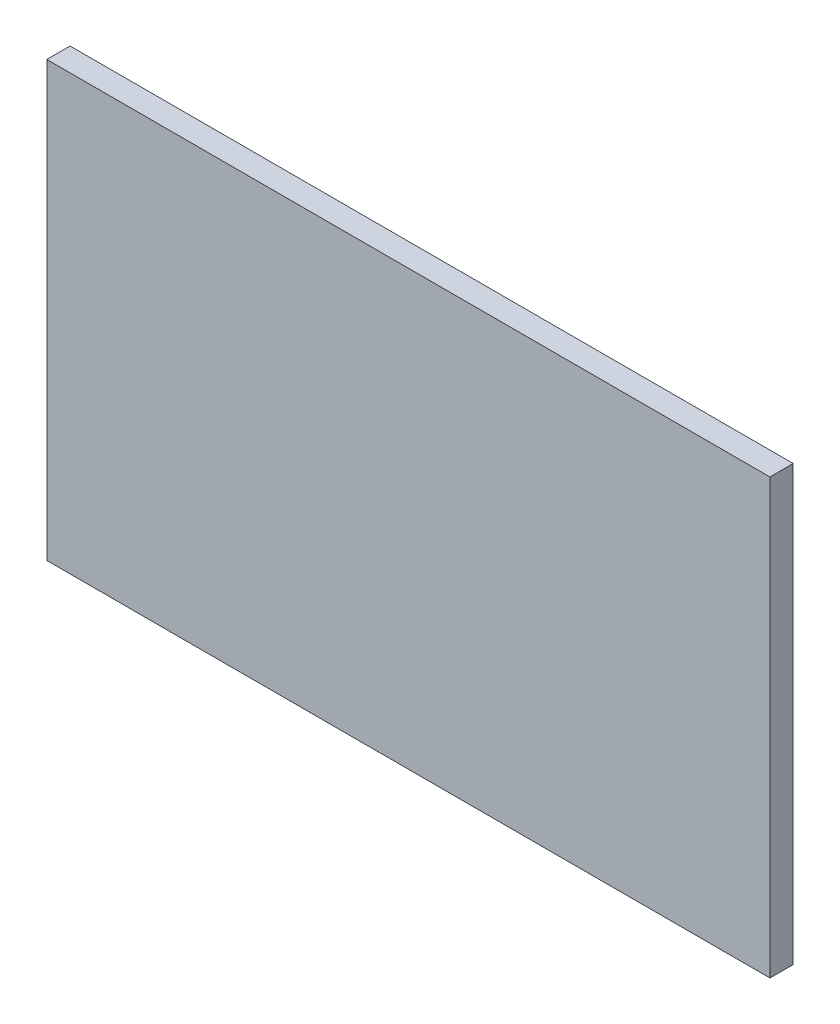
ISO-10303-21;
HEADER;
FILE_DESCRIPTION(('STEP AP214'),'2;1');
FILE_NAME('part.step','',(''),(''),'','','');
FILE_SCHEMA(('AUTOMOTIVE_DESIGN { 1 0 10303 214 1 1 1 1 }'));
ENDSEC;
DATA;
#1=APPLICATION_CONTEXT('core data for automotive mechanical design processes');
#2=APPLICATION_PROTOCOL_DEFINITION('international standard','automotive_design',2000,#1);
#3=PRODUCT_CONTEXT('',#1,'mechanical');
#4=PRODUCT('Part','Part','',(#3));
#5=PRODUCT_RELATED_PRODUCT_CATEGORY('part','',(#4));
#6=PRODUCT_DEFINITION_FORMATION('','',#4);
#7=PRODUCT_DEFINITION_CONTEXT('part definition',#1,'design');
#8=PRODUCT_DEFINITION('design','',#6,#7);
#9=PRODUCT_DEFINITION_SHAPE('','',#8);
#10=(LENGTH_UNIT() NAMED_UNIT(*) SI_UNIT(.MILLI.,.METRE.));
#11=(NAMED_UNIT(*) PLANE_ANGLE_UNIT() SI_UNIT($,.RADIAN.));
#12=(NAMED_UNIT(*) SI_UNIT($,.STERADIAN.) SOLID_ANGLE_UNIT());
#13=UNCERTAINTY_MEASURE_WITH_UNIT(LENGTH_MEASURE(1.E-05),#10,'distance_accuracy_value','');
#14=(GEOMETRIC_REPRESENTATION_CONTEXT(3) GLOBAL_UNCERTAINTY_ASSIGNED_CONTEXT((#13)) GLOBAL_UNIT_ASSIGNED_CONTEXT((#10,
#11,#12)) REPRESENTATION_CONTEXT('',''));
#15=CARTESIAN_POINT('',(0.,0.,0.));
#16=DIRECTION('',(0.,0.,1.));
#17=DIRECTION('',(1.,0.,0.));
#18=AXIS2_PLACEMENT_3D('',#15,#16,#17);
#19=CARTESIAN_POINT('',(0.,0.,1.61));
#20=DIRECTION('',(1.,0.,0.));
#21=DIRECTION('',(0.,0.,-1.));
#22=AXIS2_PLACEMENT_3D('',#19,#20,#21);
#23=PLANE('',#22);
#24=DIRECTION('',(0.,-1.,0.));
#25=VECTOR('',#24,1.);
#26=CARTESIAN_POINT('',(0.,0.,0.));
#27=LINE('',#26,#25);
#28=CARTESIAN_POINT('',(0.,0.,0.));
#29=VERTEX_POINT('',#28);
#30=CARTESIAN_POINT('',(0.,-30.,0.));
#31=VERTEX_POINT('',#30);
#32=EDGE_CURVE('E100',#29,#31,#27,.T.);
#33=ORIENTED_EDGE('',*,*,#32,.T.);
#34=DIRECTION('',(0.,0.,-1.));
#35=VECTOR('',#34,1.);
#36=CARTESIAN_POINT('',(0.,-30.,1.61));
#37=LINE('',#36,#35);
#38=CARTESIAN_POINT('',(0.,-30.,1.61));
#39=VERTEX_POINT('',#38);
#40=EDGE_CURVE('E11',#39,#31,#37,.T.);
#41=ORIENTED_EDGE('',*,*,#40,.F.);
#42=DIRECTION('',(0.,-1.,0.));
#43=VECTOR('',#42,1.);
#44=CARTESIAN_POINT('',(0.,0.,1.61));
#45=LINE('',#44,#43);
#46=CARTESIAN_POINT('',(0.,0.,1.61));
#47=VERTEX_POINT('',#46);
#48=EDGE_CURVE('E88',#47,#39,#45,.T.);
#49=ORIENTED_EDGE('',*,*,#48,.F.);
#50=DIRECTION('',(0.,0.,-1.));
#51=VECTOR('',#50,1.);
#52=CARTESIAN_POINT('',(0.,0.,1.61));
#53=LINE('',#52,#51);
#54=EDGE_CURVE('E96',#47,#29,#53,.T.);
#55=ORIENTED_EDGE('',*,*,#54,.T.);
#56=EDGE_LOOP('',(#33,#41,#49,#55));
#57=FACE_BOUND('',#56,.T.);
#58=ADVANCED_FACE('F37',(#57),#23,.F.);
#59=CARTESIAN_POINT('',(0.,-30.,1.61));
#60=DIRECTION('',(0.,1.,0.));
#61=DIRECTION('',(0.,0.,1.));
#62=AXIS2_PLACEMENT_3D('',#59,#60,#61);
#63=PLANE('',#62);
#64=DIRECTION('',(1.,0.,0.));
#65=VECTOR('',#64,1.);
#66=CARTESIAN_POINT('',(0.,-30.,0.));
#67=LINE('',#66,#65);
#68=CARTESIAN_POINT('',(50.,-30.,0.));
#69=VERTEX_POINT('',#68);
#70=EDGE_CURVE('E92',#31,#69,#67,.T.);
#71=ORIENTED_EDGE('',*,*,#70,.T.);
#72=DIRECTION('',(0.,0.,-1.));
#73=VECTOR('',#72,1.);
#74=CARTESIAN_POINT('',(50.,-30.,1.61));
#75=LINE('',#74,#73);
#76=CARTESIAN_POINT('',(50.,-30.,1.61));
#77=VERTEX_POINT('',#76);
#78=EDGE_CURVE('E45',#77,#69,#75,.T.);
#79=ORIENTED_EDGE('',*,*,#78,.F.);
#80=DIRECTION('',(1.,0.,0.));
#81=VECTOR('',#80,1.);
#82=CARTESIAN_POINT('',(0.,-30.,1.61));
#83=LINE('',#82,#81);
#84=EDGE_CURVE('E83',#39,#77,#83,.T.);
#85=ORIENTED_EDGE('',*,*,#84,.F.);
#86=ORIENTED_EDGE('',*,*,#40,.T.);
#87=EDGE_LOOP('',(#71,#79,#85,#86));
#88=FACE_BOUND('',#87,.T.);
#89=ADVANCED_FACE('F91',(#88),#63,.F.);
#90=CARTESIAN_POINT('',(50.,0.,1.61));
#91=DIRECTION('',(-1.,0.,0.));
#92=DIRECTION('',(0.,0.,1.));
#93=AXIS2_PLACEMENT_3D('',#90,#91,#92);
#94=PLANE('',#93);
#95=DIRECTION('',(0.,1.,0.));
#96=VECTOR('',#95,1.);
#97=CARTESIAN_POINT('',(50.,0.,0.));
#98=LINE('',#97,#96);
#99=CARTESIAN_POINT('',(50.,0.,0.));
#100=VERTEX_POINT('',#99);
#101=EDGE_CURVE('E70',#69,#100,#98,.T.);
#102=ORIENTED_EDGE('',*,*,#101,.T.);
#103=DIRECTION('',(0.,0.,-1.));
#104=VECTOR('',#103,1.);
#105=CARTESIAN_POINT('',(50.,0.,1.61));
#106=LINE('',#105,#104);
#107=CARTESIAN_POINT('',(50.,0.,1.61));
#108=VERTEX_POINT('',#107);
#109=EDGE_CURVE('E93',#108,#100,#106,.T.);
#110=ORIENTED_EDGE('',*,*,#109,.F.);
#111=DIRECTION('',(0.,1.,0.));
#112=VECTOR('',#111,1.);
#113=CARTESIAN_POINT('',(50.,0.,1.61));
#114=LINE('',#113,#112);
#115=EDGE_CURVE('E86',#77,#108,#114,.T.);
#116=ORIENTED_EDGE('',*,*,#115,.F.);
#117=ORIENTED_EDGE('',*,*,#78,.T.);
#118=EDGE_LOOP('',(#102,#110,#116,#117));
#119=FACE_BOUND('',#118,.T.);
#120=ADVANCED_FACE('F94',(#119),#94,.F.);
#121=CARTESIAN_POINT('',(0.,0.,1.61));
#122=DIRECTION('',(0.,-1.,0.));
#123=DIRECTION('',(0.,0.,-1.));
#124=AXIS2_PLACEMENT_3D('',#121,#122,#123);
#125=PLANE('',#124);
#126=DIRECTION('',(-1.,0.,0.));
#127=VECTOR('',#126,1.);
#128=CARTESIAN_POINT('',(0.,0.,0.));
#129=LINE('',#128,#127);
#130=EDGE_CURVE('E76',#100,#29,#129,.T.);
#131=ORIENTED_EDGE('',*,*,#130,.T.);
#132=ORIENTED_EDGE('',*,*,#54,.F.);
#133=DIRECTION('',(-1.,0.,0.));
#134=VECTOR('',#133,1.);
#135=CARTESIAN_POINT('',(0.,0.,1.61));
#136=LINE('',#135,#134);
#137=EDGE_CURVE('E53',#108,#47,#136,.T.);
#138=ORIENTED_EDGE('',*,*,#137,.F.);
#139=ORIENTED_EDGE('',*,*,#109,.T.);
#140=EDGE_LOOP('',(#131,#132,#138,#139));
#141=FACE_BOUND('',#140,.T.);
#142=ADVANCED_FACE('F107',(#141),#125,.F.);
#143=CARTESIAN_POINT('',(0.,0.,1.61));
#144=DIRECTION('',(0.,0.,1.));
#145=DIRECTION('',(1.,0.,0.));
#146=AXIS2_PLACEMENT_3D('',#143,#144,#145);
#147=PLANE('',#146);
#148=ORIENTED_EDGE('',*,*,#48,.T.);
#149=ORIENTED_EDGE('',*,*,#84,.T.);
#150=ORIENTED_EDGE('',*,*,#115,.T.);
#151=ORIENTED_EDGE('',*,*,#137,.T.);
#152=EDGE_LOOP('',(#148,#149,#150,#151));
#153=FACE_BOUND('',#152,.T.);
#154=ADVANCED_FACE('F84',(#153),#147,.T.);
#155=CARTESIAN_POINT('',(0.,0.,0.));
#156=DIRECTION('',(0.,0.,1.));
#157=DIRECTION('',(1.,0.,0.));
#158=AXIS2_PLACEMENT_3D('',#155,#156,#157);
#159=PLANE('',#158);
#160=ORIENTED_EDGE('',*,*,#32,.F.);
#161=ORIENTED_EDGE('',*,*,#130,.F.);
#162=ORIENTED_EDGE('',*,*,#101,.F.);
#163=ORIENTED_EDGE('',*,*,#70,.F.);
#164=EDGE_LOOP('',(#160,#161,#162,#163));
#165=FACE_BOUND('',#164,.T.);
#166=ADVANCED_FACE('F110',(#165),#159,.F.);
#167=CLOSED_SHELL('',(#58,#89,#120,#142,#154,#166));
#168=MANIFOLD_SOLID_BREP('B2',#167);
#169=ADVANCED_BREP_SHAPE_REPRESENTATION('',(#18,#168),#14);
#170=SHAPE_DEFINITION_REPRESENTATION(#9,#169);
ENDSEC;
END-ISO-10303-21;
